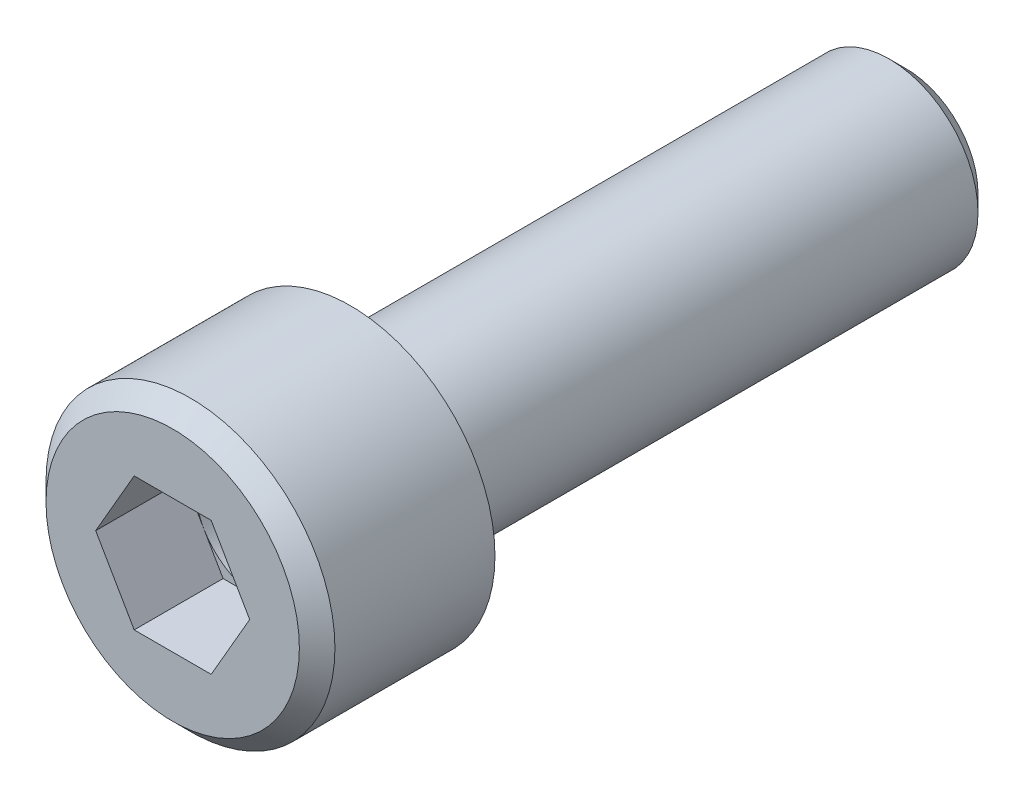
ISO-10303-21;
HEADER;
FILE_DESCRIPTION(('STEP AP214'),'2;1');
FILE_NAME('part.step','',(''),(''),'','','');
FILE_SCHEMA(('AUTOMOTIVE_DESIGN { 1 0 10303 214 1 1 1 1 }'));
ENDSEC;
DATA;
#1=APPLICATION_CONTEXT('core data for automotive mechanical design processes');
#2=APPLICATION_PROTOCOL_DEFINITION('international standard','automotive_design',2000,#1);
#3=PRODUCT_CONTEXT('',#1,'mechanical');
#4=PRODUCT('Part','Part','',(#3));
#5=PRODUCT_RELATED_PRODUCT_CATEGORY('part','',(#4));
#6=PRODUCT_DEFINITION_FORMATION('','',#4);
#7=PRODUCT_DEFINITION_CONTEXT('part definition',#1,'design');
#8=PRODUCT_DEFINITION('design','',#6,#7);
#9=PRODUCT_DEFINITION_SHAPE('','',#8);
#10=(LENGTH_UNIT() NAMED_UNIT(*) SI_UNIT(.MILLI.,.METRE.));
#11=(NAMED_UNIT(*) PLANE_ANGLE_UNIT() SI_UNIT($,.RADIAN.));
#12=(NAMED_UNIT(*) SI_UNIT($,.STERADIAN.) SOLID_ANGLE_UNIT());
#13=UNCERTAINTY_MEASURE_WITH_UNIT(LENGTH_MEASURE(1.E-05),#10,'distance_accuracy_value','');
#14=(GEOMETRIC_REPRESENTATION_CONTEXT(3) GLOBAL_UNCERTAINTY_ASSIGNED_CONTEXT((#13)) GLOBAL_UNIT_ASSIGNED_CONTEXT((#10,
#11,#12)) REPRESENTATION_CONTEXT('',''));
#15=CARTESIAN_POINT('',(0.,0.,0.));
#16=DIRECTION('',(0.,0.,1.));
#17=DIRECTION('',(1.,0.,0.));
#18=AXIS2_PLACEMENT_3D('',#15,#16,#17);
#19=CARTESIAN_POINT('',(-78.0000000000002,-17.5,15.0000000000001));
#20=DIRECTION('',(0.,0.,-1.));
#21=DIRECTION('',(-1.,0.,0.));
#22=AXIS2_PLACEMENT_3D('',#19,#20,#21);
#23=PLANE('',#22);
#24=DIRECTION('',(-1.,0.,0.));
#25=VECTOR('',#24,1.);
#26=CARTESIAN_POINT('',(-78.0000000000002,-14.5,15.0000000000001));
#27=LINE('',#26,#25);
#28=CARTESIAN_POINT('',(-78.0000000000002,-14.5,15.0000000000001));
#29=VERTEX_POINT('',#28);
#30=CARTESIAN_POINT('',(-76.2679491924313,-14.5,15.0000000000001));
#31=VERTEX_POINT('',#30);
#32=EDGE_CURVE('E94',#29,#31,#27,.F.);
#33=ORIENTED_EDGE('',*,*,#32,.F.);
#34=CARTESIAN_POINT('',(-78.0000000000002,-17.5,15.0000000000001));
#35=DIRECTION('',(0.,0.,1.));
#36=DIRECTION('',(1.,0.,0.));
#37=AXIS2_PLACEMENT_3D('',#34,#35,#36);
#38=CIRCLE('',#37,3.);
#39=CARTESIAN_POINT('',(-75.4019237886469,-16.,15.0000000000001));
#40=VERTEX_POINT('',#39);
#41=EDGE_CURVE('E108',#29,#40,#38,.F.);
#42=ORIENTED_EDGE('',*,*,#41,.T.);
#43=DIRECTION('',(0.49999999999999,-0.866025403784445,0.));
#44=VECTOR('',#43,1.);
#45=CARTESIAN_POINT('',(-76.2679491924313,-14.5,15.0000000000001));
#46=LINE('',#45,#44);
#47=EDGE_CURVE('E99',#31,#40,#46,.T.);
#48=ORIENTED_EDGE('',*,*,#47,.F.);
#49=EDGE_LOOP('',(#33,#42,#48));
#50=FACE_BOUND('',#49,.T.);
#51=ADVANCED_FACE('F16',(#50),#23,.F.);
#52=CARTESIAN_POINT('',(-78.0000000000002,-17.5,15.0000000000001));
#53=DIRECTION('',(0.,0.,-1.));
#54=DIRECTION('',(-1.,0.,0.));
#55=AXIS2_PLACEMENT_3D('',#52,#53,#54);
#56=PLANE('',#55);
#57=DIRECTION('',(0.50000000000002,-0.866025403784427,0.));
#58=VECTOR('',#57,1.);
#59=CARTESIAN_POINT('',(-75.4019237886469,-16.,15.0000000000001));
#60=LINE('',#59,#58);
#61=CARTESIAN_POINT('',(-74.5358983848624,-17.5,15.0000000000001));
#62=VERTEX_POINT('',#61);
#63=EDGE_CURVE('E103',#40,#62,#60,.T.);
#64=ORIENTED_EDGE('',*,*,#63,.F.);
#65=CARTESIAN_POINT('',(-78.0000000000002,-17.5,15.0000000000001));
#66=DIRECTION('',(0.,0.,1.));
#67=DIRECTION('',(1.,0.,0.));
#68=AXIS2_PLACEMENT_3D('',#65,#66,#67);
#69=CIRCLE('',#68,3.);
#70=CARTESIAN_POINT('',(-75.4019237886469,-19.,15.0000000000001));
#71=VERTEX_POINT('',#70);
#72=EDGE_CURVE('E112',#40,#71,#69,.F.);
#73=ORIENTED_EDGE('',*,*,#72,.T.);
#74=DIRECTION('',(-0.50000000000002,-0.866025403784427,0.));
#75=VECTOR('',#74,1.);
#76=CARTESIAN_POINT('',(-74.5358983848624,-17.5,15.0000000000001));
#77=LINE('',#76,#75);
#78=EDGE_CURVE('E120',#62,#71,#77,.T.);
#79=ORIENTED_EDGE('',*,*,#78,.F.);
#80=EDGE_LOOP('',(#64,#73,#79));
#81=FACE_BOUND('',#80,.T.);
#82=ADVANCED_FACE('F118',(#81),#56,.F.);
#83=CARTESIAN_POINT('',(-78.0000000000002,-17.5,15.0000000000001));
#84=DIRECTION('',(0.,0.,-1.));
#85=DIRECTION('',(-1.,0.,0.));
#86=AXIS2_PLACEMENT_3D('',#83,#84,#85);
#87=PLANE('',#86);
#88=DIRECTION('',(-0.499999999999989,-0.866025403784445,0.));
#89=VECTOR('',#88,1.);
#90=CARTESIAN_POINT('',(-75.4019237886469,-19.,15.0000000000001));
#91=LINE('',#90,#89);
#92=CARTESIAN_POINT('',(-76.2679491924313,-20.5,15.0000000000001));
#93=VERTEX_POINT('',#92);
#94=EDGE_CURVE('E177',#71,#93,#91,.T.);
#95=ORIENTED_EDGE('',*,*,#94,.F.);
#96=CARTESIAN_POINT('',(-78.0000000000002,-17.5,15.0000000000001));
#97=DIRECTION('',(0.,0.,1.));
#98=DIRECTION('',(1.,0.,0.));
#99=AXIS2_PLACEMENT_3D('',#96,#97,#98);
#100=CIRCLE('',#99,3.);
#101=CARTESIAN_POINT('',(-78.0000000000002,-20.5,15.0000000000001));
#102=VERTEX_POINT('',#101);
#103=EDGE_CURVE('E126',#71,#102,#100,.F.);
#104=ORIENTED_EDGE('',*,*,#103,.T.);
#105=DIRECTION('',(-1.,0.,0.));
#106=VECTOR('',#105,1.);
#107=CARTESIAN_POINT('',(-78.0000000000002,-20.5,15.0000000000001));
#108=LINE('',#107,#106);
#109=EDGE_CURVE('E113',#93,#102,#108,.T.);
#110=ORIENTED_EDGE('',*,*,#109,.F.);
#111=EDGE_LOOP('',(#95,#104,#110));
#112=FACE_BOUND('',#111,.T.);
#113=ADVANCED_FACE('F341',(#112),#87,.F.);
#114=CARTESIAN_POINT('',(-78.0000000000002,-17.5,14.00000000001));
#115=DIRECTION('',(0.,0.,1.));
#116=DIRECTION('',(1.,0.,0.));
#117=AXIS2_PLACEMENT_3D('',#114,#115,#116);
#118=CONICAL_SURFACE('',#117,2.99999999996998,1.04719755116123);
#119=CARTESIAN_POINT('',(-78.0000000000002,-17.5,14.0000000000001));
#120=DIRECTION('',(0.,0.,1.));
#121=DIRECTION('',(1.,0.,0.));
#122=AXIS2_PLACEMENT_3D('',#119,#120,#121);
#123=CIRCLE('',#122,3.);
#124=CARTESIAN_POINT('',(-75.0000000000002,-17.5,14.0000000000001));
#125=VERTEX_POINT('',#124);
#126=EDGE_CURVE('E135',#125,#125,#123,.T.);
#127=ORIENTED_EDGE('',*,*,#126,.T.);
#128=EDGE_LOOP('',(#127));
#129=FACE_BOUND('',#128,.T.);
#130=CARTESIAN_POINT('',(-78.0000000000002,-17.5000000000978,12.2679491924487));
#131=VERTEX_POINT('',#130);
#132=VERTEX_LOOP('',#131);
#133=FACE_BOUND('',#132,.T.);
#134=ADVANCED_FACE('F337',(#129,#133),#118,.F.);
#135=CARTESIAN_POINT('',(-78.0000000000002,-17.5,15.0000000000001));
#136=DIRECTION('',(0.,0.,-1.));
#137=DIRECTION('',(-1.,0.,0.));
#138=AXIS2_PLACEMENT_3D('',#135,#136,#137);
#139=PLANE('',#138);
#140=DIRECTION('',(-1.,0.,0.));
#141=VECTOR('',#140,1.);
#142=CARTESIAN_POINT('',(-78.0000000000002,-20.5,15.0000000000001));
#143=LINE('',#142,#141);
#144=CARTESIAN_POINT('',(-79.732050807569,-20.5,15.0000000000001));
#145=VERTEX_POINT('',#144);
#146=EDGE_CURVE('E128',#102,#145,#143,.T.);
#147=ORIENTED_EDGE('',*,*,#146,.F.);
#148=CARTESIAN_POINT('',(-78.0000000000002,-17.5,15.0000000000001));
#149=DIRECTION('',(0.,0.,1.));
#150=DIRECTION('',(1.,0.,0.));
#151=AXIS2_PLACEMENT_3D('',#148,#149,#150);
#152=CIRCLE('',#151,3.);
#153=CARTESIAN_POINT('',(-80.5980762113535,-19.,15.0000000000001));
#154=VERTEX_POINT('',#153);
#155=EDGE_CURVE('E131',#102,#154,#152,.F.);
#156=ORIENTED_EDGE('',*,*,#155,.T.);
#157=DIRECTION('',(-0.500000000000032,0.86602540378442,0.));
#158=VECTOR('',#157,1.);
#159=CARTESIAN_POINT('',(-79.732050807569,-20.5,15.0000000000001));
#160=LINE('',#159,#158);
#161=EDGE_CURVE('E199',#145,#154,#160,.T.);
#162=ORIENTED_EDGE('',*,*,#161,.F.);
#163=EDGE_LOOP('',(#147,#156,#162));
#164=FACE_BOUND('',#163,.T.);
#165=ADVANCED_FACE('F333',(#164),#139,.F.);
#166=CARTESIAN_POINT('',(-78.0000000000002,-17.5,15.0000000000001));
#167=DIRECTION('',(0.,0.,-1.));
#168=DIRECTION('',(-1.,0.,0.));
#169=AXIS2_PLACEMENT_3D('',#166,#167,#168);
#170=PLANE('',#169);
#171=DIRECTION('',(-0.499999999999984,0.866025403784448,0.));
#172=VECTOR('',#171,1.);
#173=CARTESIAN_POINT('',(-80.5980762113535,-19.,15.0000000000001));
#174=LINE('',#173,#172);
#175=CARTESIAN_POINT('',(-81.4641016151379,-17.5,15.0000000000001));
#176=VERTEX_POINT('',#175);
#177=EDGE_CURVE('E203',#154,#176,#174,.T.);
#178=ORIENTED_EDGE('',*,*,#177,.F.);
#179=CARTESIAN_POINT('',(-78.0000000000002,-17.5,15.0000000000001));
#180=DIRECTION('',(0.,0.,1.));
#181=DIRECTION('',(1.,0.,0.));
#182=AXIS2_PLACEMENT_3D('',#179,#180,#181);
#183=CIRCLE('',#182,3.);
#184=CARTESIAN_POINT('',(-80.5980762113535,-16.,15.0000000000001));
#185=VERTEX_POINT('',#184);
#186=EDGE_CURVE('E134',#154,#185,#183,.F.);
#187=ORIENTED_EDGE('',*,*,#186,.T.);
#188=DIRECTION('',(0.499999999999983,0.866025403784448,0.));
#189=VECTOR('',#188,1.);
#190=CARTESIAN_POINT('',(-81.4641016151379,-17.5,15.0000000000001));
#191=LINE('',#190,#189);
#192=EDGE_CURVE('E186',#176,#185,#191,.T.);
#193=ORIENTED_EDGE('',*,*,#192,.F.);
#194=EDGE_LOOP('',(#178,#187,#193));
#195=FACE_BOUND('',#194,.T.);
#196=ADVANCED_FACE('F329',(#195),#170,.F.);
#197=CARTESIAN_POINT('',(-78.0000000000002,-17.5,19.0000000000001));
#198=DIRECTION('',(0.,0.,1.));
#199=DIRECTION('',(1.,0.,0.));
#200=AXIS2_PLACEMENT_3D('',#197,#198,#199);
#201=CYLINDRICAL_SURFACE('',#200,3.);
#202=ORIENTED_EDGE('',*,*,#126,.F.);
#203=EDGE_LOOP('',(#202));
#204=FACE_BOUND('',#203,.T.);
#205=CARTESIAN_POINT('',(-78.0000000000002,-17.5,15.0000000000001));
#206=DIRECTION('',(0.,0.,1.));
#207=DIRECTION('',(1.,0.,0.));
#208=AXIS2_PLACEMENT_3D('',#205,#206,#207);
#209=CIRCLE('',#208,3.);
#210=EDGE_CURVE('E138',#29,#185,#209,.T.);
#211=ORIENTED_EDGE('',*,*,#210,.T.);
#212=ORIENTED_EDGE('',*,*,#186,.F.);
#213=ORIENTED_EDGE('',*,*,#155,.F.);
#214=ORIENTED_EDGE('',*,*,#103,.F.);
#215=ORIENTED_EDGE('',*,*,#72,.F.);
#216=ORIENTED_EDGE('',*,*,#41,.F.);
#217=EDGE_LOOP('',(#211,#212,#213,#214,#215,#216));
#218=FACE_BOUND('',#217,.T.);
#219=ADVANCED_FACE('F123',(#204,#218),#201,.F.);
#220=CARTESIAN_POINT('',(-78.0000000000002,-17.5,15.0000000000001));
#221=DIRECTION('',(0.,0.,-1.));
#222=DIRECTION('',(-1.,0.,0.));
#223=AXIS2_PLACEMENT_3D('',#220,#221,#222);
#224=PLANE('',#223);
#225=DIRECTION('',(-0.5,-0.866025403784439,0.));
#226=VECTOR('',#225,1.);
#227=CARTESIAN_POINT('',(-80.5980762113535,-16.,15.0000000000001));
#228=LINE('',#227,#226);
#229=CARTESIAN_POINT('',(-79.732050807569,-14.5,15.0000000000001));
#230=VERTEX_POINT('',#229);
#231=EDGE_CURVE('E140',#230,#185,#228,.T.);
#232=ORIENTED_EDGE('',*,*,#231,.T.);
#233=ORIENTED_EDGE('',*,*,#210,.F.);
#234=DIRECTION('',(1.,0.,0.));
#235=VECTOR('',#234,1.);
#236=CARTESIAN_POINT('',(-78.0000000000002,-14.5,15.0000000000001));
#237=LINE('',#236,#235);
#238=EDGE_CURVE('E213',#29,#230,#237,.F.);
#239=ORIENTED_EDGE('',*,*,#238,.T.);
#240=EDGE_LOOP('',(#232,#233,#239));
#241=FACE_BOUND('',#240,.T.);
#242=ADVANCED_FACE('F322',(#241),#224,.F.);
#243=CARTESIAN_POINT('',(-80.5980762113535,-16.,18.5000000000001));
#244=DIRECTION('',(-0.866025403784439,0.5,0.));
#245=DIRECTION('',(-0.5,-0.866025403784439,0.));
#246=AXIS2_PLACEMENT_3D('',#243,#244,#245);
#247=PLANE('',#246);
#248=DIRECTION('',(0.,0.,1.));
#249=VECTOR('',#248,1.);
#250=CARTESIAN_POINT('',(-79.732050807569,-14.5,19.0000000000001));
#251=LINE('',#250,#249);
#252=CARTESIAN_POINT('',(-79.732050807569,-14.5,19.0000000000001));
#253=VERTEX_POINT('',#252);
#254=EDGE_CURVE('E157',#230,#253,#251,.T.);
#255=ORIENTED_EDGE('',*,*,#254,.T.);
#256=DIRECTION('',(0.500000000000008,0.866025403784434,0.));
#257=VECTOR('',#256,1.);
#258=CARTESIAN_POINT('',(-81.4641016151379,-17.5,19.0000000000001));
#259=LINE('',#258,#257);
#260=CARTESIAN_POINT('',(-81.4641016151379,-17.5,19.0000000000001));
#261=VERTEX_POINT('',#260);
#262=EDGE_CURVE('E195',#261,#253,#259,.T.);
#263=ORIENTED_EDGE('',*,*,#262,.F.);
#264=DIRECTION('',(0.,0.,1.));
#265=VECTOR('',#264,1.);
#266=CARTESIAN_POINT('',(-81.4641016151379,-17.5,18.5000000000001));
#267=LINE('',#266,#265);
#268=EDGE_CURVE('E190',#261,#176,#267,.F.);
#269=ORIENTED_EDGE('',*,*,#268,.T.);
#270=ORIENTED_EDGE('',*,*,#192,.T.);
#271=ORIENTED_EDGE('',*,*,#231,.F.);
#272=EDGE_LOOP('',(#255,#263,#269,#270,#271));
#273=FACE_BOUND('',#272,.T.);
#274=ADVANCED_FACE('F318',(#273),#247,.F.);
#275=CARTESIAN_POINT('',(-78.0000000000002,-14.5,19.0000000000001));
#276=DIRECTION('',(0.,1.,0.));
#277=DIRECTION('',(0.,0.,1.));
#278=AXIS2_PLACEMENT_3D('',#275,#276,#277);
#279=PLANE('',#278);
#280=DIRECTION('',(0.,0.,1.));
#281=VECTOR('',#280,1.);
#282=CARTESIAN_POINT('',(-76.2679491924313,-14.5,18.5000000000001));
#283=LINE('',#282,#281);
#284=CARTESIAN_POINT('',(-76.2679491924313,-14.5,19.0000000000001));
#285=VERTEX_POINT('',#284);
#286=EDGE_CURVE('E105',#285,#31,#283,.F.);
#287=ORIENTED_EDGE('',*,*,#286,.F.);
#288=DIRECTION('',(1.,0.,0.));
#289=VECTOR('',#288,1.);
#290=CARTESIAN_POINT('',(-78.0000000000002,-14.5,19.0000000000001));
#291=LINE('',#290,#289);
#292=EDGE_CURVE('E223',#253,#285,#291,.T.);
#293=ORIENTED_EDGE('',*,*,#292,.F.);
#294=ORIENTED_EDGE('',*,*,#254,.F.);
#295=ORIENTED_EDGE('',*,*,#238,.F.);
#296=ORIENTED_EDGE('',*,*,#32,.T.);
#297=EDGE_LOOP('',(#287,#293,#294,#295,#296));
#298=FACE_BOUND('',#297,.T.);
#299=ADVANCED_FACE('F315',(#298),#279,.F.);
#300=CARTESIAN_POINT('',(-75.4019237886469,-16.,18.5000000000001));
#301=DIRECTION('',(-0.866025403784439,-0.5,0.));
#302=DIRECTION('',(0.5,-0.866025403784439,0.));
#303=AXIS2_PLACEMENT_3D('',#300,#301,#302);
#304=PLANE('',#303);
#305=DIRECTION('',(0.500000000000005,-0.866025403784436,0.));
#306=VECTOR('',#305,1.);
#307=CARTESIAN_POINT('',(-76.2679491924313,-14.5,19.0000000000001));
#308=LINE('',#307,#306);
#309=CARTESIAN_POINT('',(-74.5358983848624,-17.5,19.0000000000001));
#310=VERTEX_POINT('',#309);
#311=EDGE_CURVE('E226',#285,#310,#308,.T.);
#312=ORIENTED_EDGE('',*,*,#311,.F.);
#313=ORIENTED_EDGE('',*,*,#286,.T.);
#314=ORIENTED_EDGE('',*,*,#47,.T.);
#315=ORIENTED_EDGE('',*,*,#63,.T.);
#316=DIRECTION('',(0.,0.,1.));
#317=VECTOR('',#316,1.);
#318=CARTESIAN_POINT('',(-74.5358983848624,-17.5,18.5000000000001));
#319=LINE('',#318,#317);
#320=EDGE_CURVE('E156',#310,#62,#319,.F.);
#321=ORIENTED_EDGE('',*,*,#320,.F.);
#322=EDGE_LOOP('',(#312,#313,#314,#315,#321));
#323=FACE_BOUND('',#322,.T.);
#324=ADVANCED_FACE('F101',(#323),#304,.T.);
#325=CARTESIAN_POINT('',(-75.4019237886469,-19.,18.5000000000001));
#326=DIRECTION('',(-0.866025403784439,0.5,0.));
#327=DIRECTION('',(-0.5,-0.866025403784439,0.));
#328=AXIS2_PLACEMENT_3D('',#325,#326,#327);
#329=PLANE('',#328);
#330=DIRECTION('',(-0.500000000000005,-0.866025403784436,0.));
#331=VECTOR('',#330,1.);
#332=CARTESIAN_POINT('',(-74.5358983848624,-17.5,19.0000000000001));
#333=LINE('',#332,#331);
#334=CARTESIAN_POINT('',(-76.2679491924313,-20.5,19.0000000000001));
#335=VERTEX_POINT('',#334);
#336=EDGE_CURVE('E229',#310,#335,#333,.T.);
#337=ORIENTED_EDGE('',*,*,#336,.F.);
#338=ORIENTED_EDGE('',*,*,#320,.T.);
#339=ORIENTED_EDGE('',*,*,#78,.T.);
#340=ORIENTED_EDGE('',*,*,#94,.T.);
#341=DIRECTION('',(0.,0.,1.));
#342=VECTOR('',#341,1.);
#343=CARTESIAN_POINT('',(-76.2679491924313,-20.5,19.0000000000001));
#344=LINE('',#343,#342);
#345=EDGE_CURVE('E161',#335,#93,#344,.F.);
#346=ORIENTED_EDGE('',*,*,#345,.F.);
#347=EDGE_LOOP('',(#337,#338,#339,#340,#346));
#348=FACE_BOUND('',#347,.T.);
#349=ADVANCED_FACE('F308',(#348),#329,.T.);
#350=CARTESIAN_POINT('',(-78.0000000000002,-20.5,19.0000000000001));
#351=DIRECTION('',(0.,1.,0.));
#352=DIRECTION('',(0.,0.,1.));
#353=AXIS2_PLACEMENT_3D('',#350,#351,#352);
#354=PLANE('',#353);
#355=DIRECTION('',(1.,0.,0.));
#356=VECTOR('',#355,1.);
#357=CARTESIAN_POINT('',(-78.0000000000002,-20.5,19.0000000000001));
#358=LINE('',#357,#356);
#359=CARTESIAN_POINT('',(-79.732050807569,-20.5,19.0000000000001));
#360=VERTEX_POINT('',#359);
#361=EDGE_CURVE('E232',#335,#360,#358,.F.);
#362=ORIENTED_EDGE('',*,*,#361,.F.);
#363=ORIENTED_EDGE('',*,*,#345,.T.);
#364=ORIENTED_EDGE('',*,*,#109,.T.);
#365=ORIENTED_EDGE('',*,*,#146,.T.);
#366=DIRECTION('',(0.,0.,1.));
#367=VECTOR('',#366,1.);
#368=CARTESIAN_POINT('',(-79.7320508075691,-20.5,18.5000000000001));
#369=LINE('',#368,#367);
#370=EDGE_CURVE('E166',#145,#360,#369,.T.);
#371=ORIENTED_EDGE('',*,*,#370,.T.);
#372=EDGE_LOOP('',(#362,#363,#364,#365,#371));
#373=FACE_BOUND('',#372,.T.);
#374=ADVANCED_FACE('F304',(#373),#354,.T.);
#375=CARTESIAN_POINT('',(-80.5980762113535,-19.,18.5000000000001));
#376=DIRECTION('',(-0.866025403784439,-0.5,0.));
#377=DIRECTION('',(0.5,-0.866025403784439,0.));
#378=AXIS2_PLACEMENT_3D('',#375,#376,#377);
#379=PLANE('',#378);
#380=ORIENTED_EDGE('',*,*,#268,.F.);
#381=DIRECTION('',(-0.500000000000008,0.866025403784434,0.));
#382=VECTOR('',#381,1.);
#383=CARTESIAN_POINT('',(-79.732050807569,-20.5,19.0000000000001));
#384=LINE('',#383,#382);
#385=EDGE_CURVE('E145',#360,#261,#384,.T.);
#386=ORIENTED_EDGE('',*,*,#385,.F.);
#387=ORIENTED_EDGE('',*,*,#370,.F.);
#388=ORIENTED_EDGE('',*,*,#161,.T.);
#389=ORIENTED_EDGE('',*,*,#177,.T.);
#390=EDGE_LOOP('',(#380,#386,#387,#388,#389));
#391=FACE_BOUND('',#390,.T.);
#392=ADVANCED_FACE('F300',(#391),#379,.F.);
#393=CARTESIAN_POINT('',(-78.0000000000002,-17.5,19.0000000000001));
#394=DIRECTION('',(0.,0.,1.));
#395=DIRECTION('',(1.,0.,0.));
#396=AXIS2_PLACEMENT_3D('',#393,#394,#395);
#397=PLANE('',#396);
#398=ORIENTED_EDGE('',*,*,#361,.T.);
#399=ORIENTED_EDGE('',*,*,#385,.T.);
#400=ORIENTED_EDGE('',*,*,#262,.T.);
#401=ORIENTED_EDGE('',*,*,#292,.T.);
#402=ORIENTED_EDGE('',*,*,#311,.T.);
#403=ORIENTED_EDGE('',*,*,#336,.T.);
#404=EDGE_LOOP('',(#398,#399,#400,#401,#402,#403));
#405=FACE_BOUND('',#404,.T.);
#406=CARTESIAN_POINT('',(-78.0000000000002,-17.5,18.9999999999486));
#407=DIRECTION('',(0.,0.,-1.));
#408=DIRECTION('',(-1.,0.,0.));
#409=AXIS2_PLACEMENT_3D('',#406,#407,#408);
#410=CIRCLE('',#409,5.69999999994934);
#411=CARTESIAN_POINT('',(-83.6999999999495,-17.5,18.9999999999486));
#412=VERTEX_POINT('',#411);
#413=EDGE_CURVE('E141',#412,#412,#410,.T.);
#414=ORIENTED_EDGE('',*,*,#413,.F.);
#415=EDGE_LOOP('',(#414));
#416=FACE_BOUND('',#415,.T.);
#417=ADVANCED_FACE('F296',(#405,#416),#397,.T.);
#418=CARTESIAN_POINT('',(-78.0000000000002,-17.5,18.1999999999221));
#419=DIRECTION('',(0.,0.,-1.));
#420=DIRECTION('',(-1.,0.,0.));
#421=AXIS2_PLACEMENT_3D('',#418,#419,#420);
#422=CONICAL_SURFACE('',#421,6.49999999991906,0.785398163361921);
#423=CARTESIAN_POINT('',(-78.0000000000002,-17.5,18.2000000000001));
#424=DIRECTION('',(0.,0.,-1.));
#425=DIRECTION('',(-1.,0.,0.));
#426=AXIS2_PLACEMENT_3D('',#423,#424,#425);
#427=CIRCLE('',#426,6.5);
#428=CARTESIAN_POINT('',(-84.5000000000002,-17.5,18.2000000000001));
#429=VERTEX_POINT('',#428);
#430=EDGE_CURVE('E144',#429,#429,#427,.T.);
#431=ORIENTED_EDGE('',*,*,#430,.F.);
#432=EDGE_LOOP('',(#431));
#433=FACE_BOUND('',#432,.T.);
#434=ORIENTED_EDGE('',*,*,#413,.T.);
#435=EDGE_LOOP('',(#434));
#436=FACE_BOUND('',#435,.T.);
#437=ADVANCED_FACE('F292',(#433,#436),#422,.T.);
#438=CARTESIAN_POINT('',(-78.0000000000002,-17.5,11.0000000000001));
#439=DIRECTION('',(0.,0.,-1.));
#440=DIRECTION('',(-1.,0.,0.));
#441=AXIS2_PLACEMENT_3D('',#438,#439,#440);
#442=CYLINDRICAL_SURFACE('',#441,6.5);
#443=ORIENTED_EDGE('',*,*,#430,.T.);
#444=EDGE_LOOP('',(#443));
#445=FACE_BOUND('',#444,.T.);
#446=CARTESIAN_POINT('',(-78.0000000000002,-17.5,11.0000000000001));
#447=DIRECTION('',(0.,0.,-1.));
#448=DIRECTION('',(-1.,0.,0.));
#449=AXIS2_PLACEMENT_3D('',#446,#447,#448);
#450=CIRCLE('',#449,6.5);
#451=CARTESIAN_POINT('',(-84.5000000000002,-17.5,11.0000000000001));
#452=VERTEX_POINT('',#451);
#453=EDGE_CURVE('E146',#452,#452,#450,.T.);
#454=ORIENTED_EDGE('',*,*,#453,.F.);
#455=EDGE_LOOP('',(#454));
#456=FACE_BOUND('',#455,.T.);
#457=ADVANCED_FACE('F288',(#445,#456),#442,.T.);
#458=CARTESIAN_POINT('',(-78.0000000000002,-17.5,-13.9999999999999));
#459=DIRECTION('',(0.,0.,-1.));
#460=DIRECTION('',(-1.,0.,0.));
#461=AXIS2_PLACEMENT_3D('',#458,#459,#460);
#462=PLANE('',#461);
#463=CARTESIAN_POINT('',(-78.0000000000002,-17.5,-14.00000000001));
#464=DIRECTION('',(0.,0.,1.));
#465=DIRECTION('',(1.,0.,0.));
#466=AXIS2_PLACEMENT_3D('',#463,#464,#465);
#467=CIRCLE('',#466,3.23318750007047);
#468=CARTESIAN_POINT('',(-74.7668124999297,-17.5,-14.00000000001));
#469=VERTEX_POINT('',#468);
#470=EDGE_CURVE('E149',#469,#469,#467,.T.);
#471=ORIENTED_EDGE('',*,*,#470,.F.);
#472=EDGE_LOOP('',(#471));
#473=FACE_BOUND('',#472,.T.);
#474=ADVANCED_FACE('F276',(#473),#462,.T.);
#475=CARTESIAN_POINT('',(-78.0000000000002,-17.5,11.0000000000001));
#476=DIRECTION('',(0.,0.,-1.));
#477=DIRECTION('',(-1.,0.,0.));
#478=AXIS2_PLACEMENT_3D('',#475,#476,#477);
#479=PLANE('',#478);
#480=ORIENTED_EDGE('',*,*,#453,.T.);
#481=EDGE_LOOP('',(#480));
#482=FACE_BOUND('',#481,.T.);
#483=CARTESIAN_POINT('',(-78.0000000000002,-17.5,11.0000000000001));
#484=DIRECTION('',(0.,0.,-1.));
#485=DIRECTION('',(0.,-1.,0.));
#486=AXIS2_PLACEMENT_3D('',#483,#484,#485);
#487=CIRCLE('',#486,4.4);
#488=CARTESIAN_POINT('',(-78.0000000000002,-13.1,11.0000000000001));
#489=VERTEX_POINT('',#488);
#490=CARTESIAN_POINT('',(-78.0000000000002,-21.9,11.0000000000001));
#491=VERTEX_POINT('',#490);
#492=EDGE_CURVE('E152',#489,#491,#487,.F.);
#493=ORIENTED_EDGE('',*,*,#492,.T.);
#494=CARTESIAN_POINT('',(-78.0000000000002,-17.5,11.0000000000001));
#495=DIRECTION('',(0.,0.,-1.));
#496=DIRECTION('',(0.,1.,0.));
#497=AXIS2_PLACEMENT_3D('',#494,#495,#496);
#498=CIRCLE('',#497,4.4);
#499=EDGE_CURVE('E35',#491,#489,#498,.F.);
#500=ORIENTED_EDGE('',*,*,#499,.T.);
#501=EDGE_LOOP('',(#493,#500));
#502=FACE_BOUND('',#501,.T.);
#503=ADVANCED_FACE('F267',(#482,#502),#479,.T.);
#504=CARTESIAN_POINT('',(-78.0000000000002,-17.5,-13.2331875000204));
#505=DIRECTION('',(0.,0.,1.));
#506=DIRECTION('',(1.,0.,0.));
#507=AXIS2_PLACEMENT_3D('',#504,#505,#506);
#508=CONICAL_SURFACE('',#507,4.00000000006002,0.785398163397448);
#509=CARTESIAN_POINT('',(-78.0000000000002,-17.5,-13.2331874999999));
#510=DIRECTION('',(0.,0.,1.));
#511=DIRECTION('',(1.,0.,0.));
#512=AXIS2_PLACEMENT_3D('',#509,#510,#511);
#513=CIRCLE('',#512,4.);
#514=CARTESIAN_POINT('',(-74.0000000000002,-17.5,-13.2331874999999));
#515=VERTEX_POINT('',#514);
#516=EDGE_CURVE('E27',#515,#515,#513,.T.);
#517=ORIENTED_EDGE('',*,*,#516,.F.);
#518=EDGE_LOOP('',(#517));
#519=FACE_BOUND('',#518,.T.);
#520=ORIENTED_EDGE('',*,*,#470,.T.);
#521=EDGE_LOOP('',(#520));
#522=FACE_BOUND('',#521,.T.);
#523=ADVANCED_FACE('F257',(#519,#522),#508,.T.);
#524=CARTESIAN_POINT('',(-78.0000000000002,-17.5,10.6000000000001));
#525=DIRECTION('',(0.,0.,-1.));
#526=DIRECTION('',(0.,1.,0.));
#527=AXIS2_PLACEMENT_3D('',#524,#525,#526);
#528=TOROIDAL_SURFACE('',#527,4.4,0.4);
#529=ORIENTED_EDGE('',*,*,#499,.F.);
#530=ORIENTED_EDGE('',*,*,#492,.F.);
#531=EDGE_LOOP('',(#529,#530));
#532=FACE_BOUND('',#531,.T.);
#533=CARTESIAN_POINT('',(-78.0000000000002,-17.5,10.6000000000001));
#534=DIRECTION('',(0.,0.,1.));
#535=DIRECTION('',(1.,0.,0.));
#536=AXIS2_PLACEMENT_3D('',#533,#534,#535);
#537=CIRCLE('',#536,4.);
#538=CARTESIAN_POINT('',(-74.0000000000002,-17.5,10.6000000000001));
#539=VERTEX_POINT('',#538);
#540=EDGE_CURVE('E11',#539,#539,#537,.F.);
#541=ORIENTED_EDGE('',*,*,#540,.F.);
#542=EDGE_LOOP('',(#541));
#543=FACE_BOUND('',#542,.T.);
#544=ADVANCED_FACE('F245',(#532,#543),#528,.F.);
#545=CARTESIAN_POINT('',(-78.0000000000002,-17.5,11.0000000000001));
#546=DIRECTION('',(0.,0.,1.));
#547=DIRECTION('',(1.,0.,0.));
#548=AXIS2_PLACEMENT_3D('',#545,#546,#547);
#549=CYLINDRICAL_SURFACE('',#548,4.);
#550=ORIENTED_EDGE('',*,*,#516,.T.);
#551=EDGE_LOOP('',(#550));
#552=FACE_BOUND('',#551,.T.);
#553=ORIENTED_EDGE('',*,*,#540,.T.);
#554=EDGE_LOOP('',(#553));
#555=FACE_BOUND('',#554,.T.);
#556=ADVANCED_FACE('F256',(#552,#555),#549,.T.);
#557=CLOSED_SHELL('',(#51,#82,#113,#134,#165,#196,#219,#242,#274,#299,#324,#349,#374,#392,#417,
#437,#457,#474,#503,#523,#544,#556));
#558=MANIFOLD_SOLID_BREP('B1',#557);
#559=ADVANCED_BREP_SHAPE_REPRESENTATION('',(#18,#558),#14);
#560=SHAPE_DEFINITION_REPRESENTATION(#9,#559);
ENDSEC;
END-ISO-10303-21;
